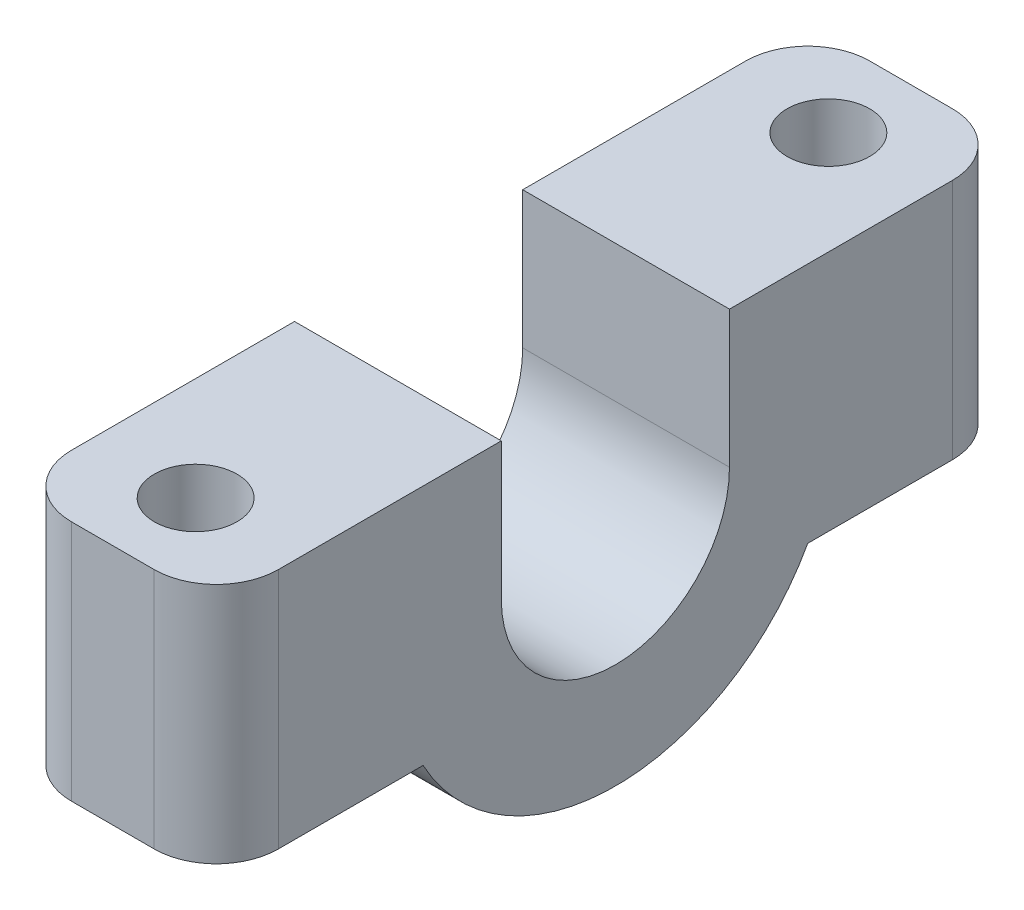
ISO-10303-21;
HEADER;
FILE_DESCRIPTION(('STEP AP214'),'2;1');
FILE_NAME('part.step','',(''),(''),'','','');
FILE_SCHEMA(('AUTOMOTIVE_DESIGN { 1 0 10303 214 1 1 1 1 }'));
ENDSEC;
DATA;
#1=APPLICATION_CONTEXT('core data for automotive mechanical design processes');
#2=APPLICATION_PROTOCOL_DEFINITION('international standard','automotive_design',2000,#1);
#3=PRODUCT_CONTEXT('',#1,'mechanical');
#4=PRODUCT('Part','Part','',(#3));
#5=PRODUCT_RELATED_PRODUCT_CATEGORY('part','',(#4));
#6=PRODUCT_DEFINITION_FORMATION('','',#4);
#7=PRODUCT_DEFINITION_CONTEXT('part definition',#1,'design');
#8=PRODUCT_DEFINITION('design','',#6,#7);
#9=PRODUCT_DEFINITION_SHAPE('','',#8);
#10=(LENGTH_UNIT() NAMED_UNIT(*) SI_UNIT(.MILLI.,.METRE.));
#11=(NAMED_UNIT(*) PLANE_ANGLE_UNIT() SI_UNIT($,.RADIAN.));
#12=(NAMED_UNIT(*) SI_UNIT($,.STERADIAN.) SOLID_ANGLE_UNIT());
#13=UNCERTAINTY_MEASURE_WITH_UNIT(LENGTH_MEASURE(1.E-05),#10,'distance_accuracy_value','');
#14=(GEOMETRIC_REPRESENTATION_CONTEXT(3) GLOBAL_UNCERTAINTY_ASSIGNED_CONTEXT((#13)) GLOBAL_UNIT_ASSIGNED_CONTEXT((#10,
#11,#12)) REPRESENTATION_CONTEXT('',''));
#15=CARTESIAN_POINT('',(0.,0.,0.));
#16=DIRECTION('',(0.,0.,1.));
#17=DIRECTION('',(1.,0.,0.));
#18=AXIS2_PLACEMENT_3D('',#15,#16,#17);
#19=CARTESIAN_POINT('',(20.,0.,0.));
#20=DIRECTION('',(-1.,0.,0.));
#21=DIRECTION('',(0.,0.,1.));
#22=AXIS2_PLACEMENT_3D('',#19,#20,#21);
#23=CYLINDRICAL_SURFACE('',#22,11.035);
#24=CARTESIAN_POINT('',(0.,0.,0.));
#25=DIRECTION('',(-1.,0.,0.));
#26=DIRECTION('',(0.,0.,-1.));
#27=AXIS2_PLACEMENT_3D('',#24,#25,#26);
#28=CIRCLE('',#27,11.035);
#29=CARTESIAN_POINT('',(0.,0.,-11.035));
#30=VERTEX_POINT('',#29);
#31=CARTESIAN_POINT('',(0.,0.,11.035));
#32=VERTEX_POINT('',#31);
#33=EDGE_CURVE('E181',#30,#32,#28,.T.);
#34=ORIENTED_EDGE('',*,*,#33,.T.);
#35=DIRECTION('',(-1.,0.,0.));
#36=VECTOR('',#35,1.);
#37=CARTESIAN_POINT('',(20.,0.,11.035));
#38=LINE('',#37,#36);
#39=CARTESIAN_POINT('',(20.,0.,11.035));
#40=VERTEX_POINT('',#39);
#41=EDGE_CURVE('E159',#40,#32,#38,.T.);
#42=ORIENTED_EDGE('',*,*,#41,.F.);
#43=CARTESIAN_POINT('',(20.,0.,0.));
#44=DIRECTION('',(-1.,0.,0.));
#45=DIRECTION('',(0.,0.,-1.));
#46=AXIS2_PLACEMENT_3D('',#43,#44,#45);
#47=CIRCLE('',#46,11.035);
#48=CARTESIAN_POINT('',(20.,0.,-11.035));
#49=VERTEX_POINT('',#48);
#50=EDGE_CURVE('E166',#49,#40,#47,.T.);
#51=ORIENTED_EDGE('',*,*,#50,.F.);
#52=DIRECTION('',(-1.,0.,0.));
#53=VECTOR('',#52,1.);
#54=CARTESIAN_POINT('',(20.,0.,-11.035));
#55=LINE('',#54,#53);
#56=EDGE_CURVE('E252',#49,#30,#55,.T.);
#57=ORIENTED_EDGE('',*,*,#56,.T.);
#58=EDGE_LOOP('',(#34,#42,#51,#57));
#59=FACE_BOUND('',#58,.T.);
#60=ADVANCED_FACE('F52',(#59),#23,.F.);
#61=CARTESIAN_POINT('',(20.,13.245,11.035));
#62=DIRECTION('',(0.,0.,1.));
#63=DIRECTION('',(1.,0.,0.));
#64=AXIS2_PLACEMENT_3D('',#61,#62,#63);
#65=PLANE('',#64);
#66=DIRECTION('',(0.,1.,0.));
#67=VECTOR('',#66,1.);
#68=CARTESIAN_POINT('',(0.,13.245,11.035));
#69=LINE('',#68,#67);
#70=CARTESIAN_POINT('',(0.,13.245,11.035));
#71=VERTEX_POINT('',#70);
#72=EDGE_CURVE('E289',#32,#71,#69,.T.);
#73=ORIENTED_EDGE('',*,*,#72,.T.);
#74=DIRECTION('',(-1.,0.,0.));
#75=VECTOR('',#74,1.);
#76=CARTESIAN_POINT('',(20.,13.245,11.035));
#77=LINE('',#76,#75);
#78=CARTESIAN_POINT('',(20.,13.245,11.035));
#79=VERTEX_POINT('',#78);
#80=EDGE_CURVE('E162',#79,#71,#77,.T.);
#81=ORIENTED_EDGE('',*,*,#80,.F.);
#82=DIRECTION('',(0.,1.,0.));
#83=VECTOR('',#82,1.);
#84=CARTESIAN_POINT('',(20.,13.245,11.035));
#85=LINE('',#84,#83);
#86=EDGE_CURVE('E152',#40,#79,#85,.T.);
#87=ORIENTED_EDGE('',*,*,#86,.F.);
#88=ORIENTED_EDGE('',*,*,#41,.T.);
#89=EDGE_LOOP('',(#73,#81,#87,#88));
#90=FACE_BOUND('',#89,.T.);
#91=ADVANCED_FACE('F160',(#90),#65,.F.);
#92=CARTESIAN_POINT('',(20.,13.245,38.6011404220279));
#93=DIRECTION('',(0.,-1.,0.));
#94=DIRECTION('',(0.,0.,-1.));
#95=AXIS2_PLACEMENT_3D('',#92,#93,#94);
#96=PLANE('',#95);
#97=CARTESIAN_POINT('',(10.,13.245,30.6));
#98=DIRECTION('',(0.,1.,0.));
#99=DIRECTION('',(0.,0.,1.));
#100=AXIS2_PLACEMENT_3D('',#97,#98,#99);
#101=CIRCLE('',#100,4.);
#102=CARTESIAN_POINT('',(10.,13.245,34.6));
#103=VERTEX_POINT('',#102);
#104=EDGE_CURVE('E313',#103,#103,#101,.T.);
#105=ORIENTED_EDGE('',*,*,#104,.F.);
#106=EDGE_LOOP('',(#105));
#107=FACE_BOUND('',#106,.T.);
#108=DIRECTION('',(0.,0.,1.));
#109=VECTOR('',#108,1.);
#110=CARTESIAN_POINT('',(0.,13.245,38.6011404220279));
#111=LINE('',#110,#109);
#112=CARTESIAN_POINT('',(0.,13.245,32.6011404220279));
#113=VERTEX_POINT('',#112);
#114=EDGE_CURVE('E282',#71,#113,#111,.T.);
#115=ORIENTED_EDGE('',*,*,#114,.T.);
#116=CARTESIAN_POINT('',(6.,13.245,32.6011404220279));
#117=DIRECTION('',(0.,-1.,0.));
#118=DIRECTION('',(0.,0.,-1.));
#119=AXIS2_PLACEMENT_3D('',#116,#117,#118);
#120=CIRCLE('',#119,6.);
#121=CARTESIAN_POINT('',(6.,13.245,38.6011404220279));
#122=VERTEX_POINT('',#121);
#123=EDGE_CURVE('E215',#113,#122,#120,.F.);
#124=ORIENTED_EDGE('',*,*,#123,.T.);
#125=DIRECTION('',(-1.,0.,0.));
#126=VECTOR('',#125,1.);
#127=CARTESIAN_POINT('',(20.,13.245,38.6011404220279));
#128=LINE('',#127,#126);
#129=CARTESIAN_POINT('',(14.,13.245,38.6011404220279));
#130=VERTEX_POINT('',#129);
#131=EDGE_CURVE('E188',#130,#122,#128,.T.);
#132=ORIENTED_EDGE('',*,*,#131,.F.);
#133=CARTESIAN_POINT('',(14.,13.245,32.6011404220279));
#134=DIRECTION('',(0.,-1.,0.));
#135=DIRECTION('',(0.,0.,-1.));
#136=AXIS2_PLACEMENT_3D('',#133,#134,#135);
#137=CIRCLE('',#136,6.);
#138=CARTESIAN_POINT('',(20.,13.245,32.6011404220279));
#139=VERTEX_POINT('',#138);
#140=EDGE_CURVE('E209',#130,#139,#137,.F.);
#141=ORIENTED_EDGE('',*,*,#140,.T.);
#142=DIRECTION('',(0.,0.,1.));
#143=VECTOR('',#142,1.);
#144=CARTESIAN_POINT('',(20.,13.245,38.6011404220279));
#145=LINE('',#144,#143);
#146=EDGE_CURVE('E170',#79,#139,#145,.T.);
#147=ORIENTED_EDGE('',*,*,#146,.F.);
#148=ORIENTED_EDGE('',*,*,#80,.T.);
#149=EDGE_LOOP('',(#115,#124,#132,#141,#147,#148));
#150=FACE_BOUND('',#149,.T.);
#151=ADVANCED_FACE('F328',(#107,#150),#96,.F.);
#152=CARTESIAN_POINT('',(20.,0.,38.6011404220279));
#153=DIRECTION('',(0.,0.,-1.));
#154=DIRECTION('',(-1.,0.,0.));
#155=AXIS2_PLACEMENT_3D('',#152,#153,#154);
#156=PLANE('',#155);
#157=ORIENTED_EDGE('',*,*,#131,.T.);
#158=DIRECTION('',(0.,-1.,0.));
#159=VECTOR('',#158,1.);
#160=CARTESIAN_POINT('',(6.,0.,38.6011404220279));
#161=LINE('',#160,#159);
#162=CARTESIAN_POINT('',(6.,-10.16,38.6011404220279));
#163=VERTEX_POINT('',#162);
#164=EDGE_CURVE('E190',#122,#163,#161,.T.);
#165=ORIENTED_EDGE('',*,*,#164,.T.);
#166=DIRECTION('',(-1.,0.,0.));
#167=VECTOR('',#166,1.);
#168=CARTESIAN_POINT('',(20.,-10.16,38.6011404220279));
#169=LINE('',#168,#167);
#170=CARTESIAN_POINT('',(14.,-10.16,38.6011404220279));
#171=VERTEX_POINT('',#170);
#172=EDGE_CURVE('E238',#171,#163,#169,.T.);
#173=ORIENTED_EDGE('',*,*,#172,.F.);
#174=DIRECTION('',(0.,-1.,0.));
#175=VECTOR('',#174,1.);
#176=CARTESIAN_POINT('',(14.,13.245,38.6011404220279));
#177=LINE('',#176,#175);
#178=EDGE_CURVE('E182',#171,#130,#177,.F.);
#179=ORIENTED_EDGE('',*,*,#178,.T.);
#180=EDGE_LOOP('',(#157,#165,#173,#179));
#181=FACE_BOUND('',#180,.T.);
#182=ADVANCED_FACE('F329',(#181),#156,.F.);
#183=CARTESIAN_POINT('',(20.,-10.16,18.6011404220279));
#184=DIRECTION('',(0.,1.,0.));
#185=DIRECTION('',(0.,0.,1.));
#186=AXIS2_PLACEMENT_3D('',#183,#184,#185);
#187=PLANE('',#186);
#188=CARTESIAN_POINT('',(10.,-10.16,30.6));
#189=DIRECTION('',(0.,1.,0.));
#190=DIRECTION('',(0.,0.,1.));
#191=AXIS2_PLACEMENT_3D('',#188,#189,#190);
#192=CIRCLE('',#191,4.);
#193=CARTESIAN_POINT('',(10.,-10.16,34.6));
#194=VERTEX_POINT('',#193);
#195=EDGE_CURVE('E295',#194,#194,#192,.F.);
#196=ORIENTED_EDGE('',*,*,#195,.F.);
#197=EDGE_LOOP('',(#196));
#198=FACE_BOUND('',#197,.T.);
#199=ORIENTED_EDGE('',*,*,#172,.T.);
#200=CARTESIAN_POINT('',(6.,-10.16,32.6011404220279));
#201=DIRECTION('',(0.,1.,0.));
#202=DIRECTION('',(0.,0.,1.));
#203=AXIS2_PLACEMENT_3D('',#200,#201,#202);
#204=CIRCLE('',#203,6.);
#205=CARTESIAN_POINT('',(0.,-10.16,32.6011404220279));
#206=VERTEX_POINT('',#205);
#207=EDGE_CURVE('E197',#163,#206,#204,.F.);
#208=ORIENTED_EDGE('',*,*,#207,.T.);
#209=DIRECTION('',(0.,0.,-1.));
#210=VECTOR('',#209,1.);
#211=CARTESIAN_POINT('',(0.,-10.16,18.6011404220279));
#212=LINE('',#211,#210);
#213=CARTESIAN_POINT('',(0.,-10.16,18.6011404220279));
#214=VERTEX_POINT('',#213);
#215=EDGE_CURVE('E285',#206,#214,#212,.T.);
#216=ORIENTED_EDGE('',*,*,#215,.T.);
#217=DIRECTION('',(-1.,0.,0.));
#218=VECTOR('',#217,1.);
#219=CARTESIAN_POINT('',(20.,-10.16,18.6011404220279));
#220=LINE('',#219,#218);
#221=CARTESIAN_POINT('',(20.,-10.16,18.6011404220279));
#222=VERTEX_POINT('',#221);
#223=EDGE_CURVE('E239',#222,#214,#220,.T.);
#224=ORIENTED_EDGE('',*,*,#223,.F.);
#225=DIRECTION('',(0.,0.,-1.));
#226=VECTOR('',#225,1.);
#227=CARTESIAN_POINT('',(20.,-10.16,18.6011404220279));
#228=LINE('',#227,#226);
#229=CARTESIAN_POINT('',(20.,-10.16,32.6011404220279));
#230=VERTEX_POINT('',#229);
#231=EDGE_CURVE('E310',#230,#222,#228,.T.);
#232=ORIENTED_EDGE('',*,*,#231,.F.);
#233=CARTESIAN_POINT('',(14.,-10.16,32.6011404220279));
#234=DIRECTION('',(0.,1.,0.));
#235=DIRECTION('',(0.,0.,1.));
#236=AXIS2_PLACEMENT_3D('',#233,#234,#235);
#237=CIRCLE('',#236,6.);
#238=EDGE_CURVE('E200',#230,#171,#237,.F.);
#239=ORIENTED_EDGE('',*,*,#238,.T.);
#240=EDGE_LOOP('',(#199,#208,#216,#224,#232,#239));
#241=FACE_BOUND('',#240,.T.);
#242=ADVANCED_FACE('F338',(#198,#241),#187,.F.);
#243=CARTESIAN_POINT('',(20.,0.,0.));
#244=DIRECTION('',(-1.,0.,0.));
#245=DIRECTION('',(0.,0.,1.));
#246=AXIS2_PLACEMENT_3D('',#243,#244,#245);
#247=CYLINDRICAL_SURFACE('',#246,21.195);
#248=CARTESIAN_POINT('',(0.,0.,0.));
#249=DIRECTION('',(1.,0.,0.));
#250=DIRECTION('',(0.,0.,-1.));
#251=AXIS2_PLACEMENT_3D('',#248,#249,#250);
#252=CIRCLE('',#251,21.195);
#253=CARTESIAN_POINT('',(0.,-10.16,-18.6011404220279));
#254=VERTEX_POINT('',#253);
#255=EDGE_CURVE('E276',#214,#254,#252,.T.);
#256=ORIENTED_EDGE('',*,*,#255,.T.);
#257=DIRECTION('',(-1.,0.,0.));
#258=VECTOR('',#257,1.);
#259=CARTESIAN_POINT('',(20.,-10.16,-18.6011404220279));
#260=LINE('',#259,#258);
#261=CARTESIAN_POINT('',(20.,-10.16,-18.6011404220279));
#262=VERTEX_POINT('',#261);
#263=EDGE_CURVE('E244',#262,#254,#260,.T.);
#264=ORIENTED_EDGE('',*,*,#263,.F.);
#265=CARTESIAN_POINT('',(20.,0.,0.));
#266=DIRECTION('',(1.,0.,0.));
#267=DIRECTION('',(0.,0.,-1.));
#268=AXIS2_PLACEMENT_3D('',#265,#266,#267);
#269=CIRCLE('',#268,21.195);
#270=EDGE_CURVE('E302',#222,#262,#269,.T.);
#271=ORIENTED_EDGE('',*,*,#270,.F.);
#272=ORIENTED_EDGE('',*,*,#223,.T.);
#273=EDGE_LOOP('',(#256,#264,#271,#272));
#274=FACE_BOUND('',#273,.T.);
#275=ADVANCED_FACE('F355',(#274),#247,.T.);
#276=CARTESIAN_POINT('',(20.,-10.16,-38.6011404220279));
#277=DIRECTION('',(0.,1.,0.));
#278=DIRECTION('',(0.,0.,1.));
#279=AXIS2_PLACEMENT_3D('',#276,#277,#278);
#280=PLANE('',#279);
#281=CARTESIAN_POINT('',(10.,-10.16,-30.6));
#282=DIRECTION('',(0.,1.,0.));
#283=DIRECTION('',(0.,0.,1.));
#284=AXIS2_PLACEMENT_3D('',#281,#282,#283);
#285=CIRCLE('',#284,4.);
#286=CARTESIAN_POINT('',(10.,-10.16,-26.6));
#287=VERTEX_POINT('',#286);
#288=EDGE_CURVE('E254',#287,#287,#285,.F.);
#289=ORIENTED_EDGE('',*,*,#288,.F.);
#290=EDGE_LOOP('',(#289));
#291=FACE_BOUND('',#290,.T.);
#292=DIRECTION('',(-1.,0.,0.));
#293=VECTOR('',#292,1.);
#294=CARTESIAN_POINT('',(20.,-10.16,-38.6011404220279));
#295=LINE('',#294,#293);
#296=CARTESIAN_POINT('',(14.,-10.16,-38.6011404220279));
#297=VERTEX_POINT('',#296);
#298=CARTESIAN_POINT('',(6.,-10.16,-38.6011404220279));
#299=VERTEX_POINT('',#298);
#300=EDGE_CURVE('E243',#297,#299,#295,.T.);
#301=ORIENTED_EDGE('',*,*,#300,.F.);
#302=CARTESIAN_POINT('',(14.,-10.16,-32.6011404220279));
#303=DIRECTION('',(0.,1.,0.));
#304=DIRECTION('',(0.,0.,1.));
#305=AXIS2_PLACEMENT_3D('',#302,#303,#304);
#306=CIRCLE('',#305,6.);
#307=CARTESIAN_POINT('',(20.,-10.16,-32.6011404220279));
#308=VERTEX_POINT('',#307);
#309=EDGE_CURVE('E11',#297,#308,#306,.F.);
#310=ORIENTED_EDGE('',*,*,#309,.T.);
#311=DIRECTION('',(0.,0.,-1.));
#312=VECTOR('',#311,1.);
#313=CARTESIAN_POINT('',(20.,-10.16,-38.6011404220279));
#314=LINE('',#313,#312);
#315=EDGE_CURVE('E297',#262,#308,#314,.T.);
#316=ORIENTED_EDGE('',*,*,#315,.F.);
#317=ORIENTED_EDGE('',*,*,#263,.T.);
#318=DIRECTION('',(0.,0.,-1.));
#319=VECTOR('',#318,1.);
#320=CARTESIAN_POINT('',(0.,-10.16,-38.6011404220279));
#321=LINE('',#320,#319);
#322=CARTESIAN_POINT('',(0.,-10.16,-32.6011404220279));
#323=VERTEX_POINT('',#322);
#324=EDGE_CURVE('E277',#254,#323,#321,.T.);
#325=ORIENTED_EDGE('',*,*,#324,.T.);
#326=CARTESIAN_POINT('',(6.,-10.16,-32.6011404220279));
#327=DIRECTION('',(0.,1.,0.));
#328=DIRECTION('',(0.,0.,1.));
#329=AXIS2_PLACEMENT_3D('',#326,#327,#328);
#330=CIRCLE('',#329,6.);
#331=EDGE_CURVE('E65',#323,#299,#330,.F.);
#332=ORIENTED_EDGE('',*,*,#331,.T.);
#333=EDGE_LOOP('',(#301,#310,#316,#317,#325,#332));
#334=FACE_BOUND('',#333,.T.);
#335=ADVANCED_FACE('F351',(#291,#334),#280,.F.);
#336=CARTESIAN_POINT('',(20.,13.245,-38.6011404220279));
#337=DIRECTION('',(0.,0.,1.));
#338=DIRECTION('',(1.,0.,0.));
#339=AXIS2_PLACEMENT_3D('',#336,#337,#338);
#340=PLANE('',#339);
#341=DIRECTION('',(-1.,0.,0.));
#342=VECTOR('',#341,1.);
#343=CARTESIAN_POINT('',(20.,13.245,-38.6011404220279));
#344=LINE('',#343,#342);
#345=CARTESIAN_POINT('',(14.,13.245,-38.6011404220279));
#346=VERTEX_POINT('',#345);
#347=CARTESIAN_POINT('',(6.,13.245,-38.6011404220279));
#348=VERTEX_POINT('',#347);
#349=EDGE_CURVE('E246',#346,#348,#344,.T.);
#350=ORIENTED_EDGE('',*,*,#349,.F.);
#351=DIRECTION('',(0.,1.,0.));
#352=VECTOR('',#351,1.);
#353=CARTESIAN_POINT('',(14.,-10.16,-38.6011404220279));
#354=LINE('',#353,#352);
#355=EDGE_CURVE('E71',#346,#297,#354,.F.);
#356=ORIENTED_EDGE('',*,*,#355,.T.);
#357=ORIENTED_EDGE('',*,*,#300,.T.);
#358=DIRECTION('',(0.,1.,0.));
#359=VECTOR('',#358,1.);
#360=CARTESIAN_POINT('',(6.,13.245,-38.6011404220279));
#361=LINE('',#360,#359);
#362=EDGE_CURVE('E230',#299,#348,#361,.T.);
#363=ORIENTED_EDGE('',*,*,#362,.T.);
#364=EDGE_LOOP('',(#350,#356,#357,#363));
#365=FACE_BOUND('',#364,.T.);
#366=ADVANCED_FACE('F364',(#365),#340,.F.);
#367=CARTESIAN_POINT('',(20.,13.245,-11.035));
#368=DIRECTION('',(0.,-1.,0.));
#369=DIRECTION('',(0.,0.,-1.));
#370=AXIS2_PLACEMENT_3D('',#367,#368,#369);
#371=PLANE('',#370);
#372=CARTESIAN_POINT('',(10.,13.245,-30.6));
#373=DIRECTION('',(0.,1.,0.));
#374=DIRECTION('',(0.,0.,1.));
#375=AXIS2_PLACEMENT_3D('',#372,#373,#374);
#376=CIRCLE('',#375,4.);
#377=CARTESIAN_POINT('',(10.,13.245,-26.6));
#378=VERTEX_POINT('',#377);
#379=EDGE_CURVE('E253',#378,#378,#376,.T.);
#380=ORIENTED_EDGE('',*,*,#379,.F.);
#381=EDGE_LOOP('',(#380));
#382=FACE_BOUND('',#381,.T.);
#383=DIRECTION('',(0.,0.,1.));
#384=VECTOR('',#383,1.);
#385=CARTESIAN_POINT('',(20.,13.245,-11.035));
#386=LINE('',#385,#384);
#387=CARTESIAN_POINT('',(20.,13.245,-32.6011404220279));
#388=VERTEX_POINT('',#387);
#389=CARTESIAN_POINT('',(20.,13.245,-11.035));
#390=VERTEX_POINT('',#389);
#391=EDGE_CURVE('E300',#388,#390,#386,.T.);
#392=ORIENTED_EDGE('',*,*,#391,.F.);
#393=CARTESIAN_POINT('',(14.,13.245,-32.6011404220279));
#394=DIRECTION('',(0.,-1.,0.));
#395=DIRECTION('',(0.,0.,-1.));
#396=AXIS2_PLACEMENT_3D('',#393,#394,#395);
#397=CIRCLE('',#396,6.);
#398=EDGE_CURVE('E228',#388,#346,#397,.F.);
#399=ORIENTED_EDGE('',*,*,#398,.T.);
#400=ORIENTED_EDGE('',*,*,#349,.T.);
#401=CARTESIAN_POINT('',(6.,13.245,-32.6011404220279));
#402=DIRECTION('',(0.,-1.,0.));
#403=DIRECTION('',(0.,0.,-1.));
#404=AXIS2_PLACEMENT_3D('',#401,#402,#403);
#405=CIRCLE('',#404,6.);
#406=CARTESIAN_POINT('',(0.,13.245,-32.6011404220279));
#407=VERTEX_POINT('',#406);
#408=EDGE_CURVE('E223',#348,#407,#405,.F.);
#409=ORIENTED_EDGE('',*,*,#408,.T.);
#410=DIRECTION('',(0.,0.,1.));
#411=VECTOR('',#410,1.);
#412=CARTESIAN_POINT('',(0.,13.245,-11.035));
#413=LINE('',#412,#411);
#414=CARTESIAN_POINT('',(0.,13.245,-11.035));
#415=VERTEX_POINT('',#414);
#416=EDGE_CURVE('E240',#407,#415,#413,.T.);
#417=ORIENTED_EDGE('',*,*,#416,.T.);
#418=DIRECTION('',(-1.,0.,0.));
#419=VECTOR('',#418,1.);
#420=CARTESIAN_POINT('',(20.,13.245,-11.035));
#421=LINE('',#420,#419);
#422=EDGE_CURVE('E247',#390,#415,#421,.T.);
#423=ORIENTED_EDGE('',*,*,#422,.F.);
#424=EDGE_LOOP('',(#392,#399,#400,#409,#417,#423));
#425=FACE_BOUND('',#424,.T.);
#426=ADVANCED_FACE('F365',(#382,#425),#371,.F.);
#427=CARTESIAN_POINT('',(20.,0.,-11.035));
#428=DIRECTION('',(0.,0.,-1.));
#429=DIRECTION('',(-1.,0.,0.));
#430=AXIS2_PLACEMENT_3D('',#427,#428,#429);
#431=PLANE('',#430);
#432=DIRECTION('',(0.,-1.,0.));
#433=VECTOR('',#432,1.);
#434=CARTESIAN_POINT('',(0.,0.,-11.035));
#435=LINE('',#434,#433);
#436=EDGE_CURVE('E178',#415,#30,#435,.T.);
#437=ORIENTED_EDGE('',*,*,#436,.T.);
#438=ORIENTED_EDGE('',*,*,#56,.F.);
#439=DIRECTION('',(0.,-1.,0.));
#440=VECTOR('',#439,1.);
#441=CARTESIAN_POINT('',(20.,0.,-11.035));
#442=LINE('',#441,#440);
#443=EDGE_CURVE('E173',#390,#49,#442,.T.);
#444=ORIENTED_EDGE('',*,*,#443,.F.);
#445=ORIENTED_EDGE('',*,*,#422,.T.);
#446=EDGE_LOOP('',(#437,#438,#444,#445));
#447=FACE_BOUND('',#446,.T.);
#448=ADVANCED_FACE('F375',(#447),#431,.F.);
#449=CARTESIAN_POINT('',(20.,0.,0.));
#450=DIRECTION('',(1.,0.,0.));
#451=DIRECTION('',(0.,0.,-1.));
#452=AXIS2_PLACEMENT_3D('',#449,#450,#451);
#453=PLANE('',#452);
#454=ORIENTED_EDGE('',*,*,#146,.T.);
#455=DIRECTION('',(0.,-1.,0.));
#456=VECTOR('',#455,1.);
#457=CARTESIAN_POINT('',(20.,-10.16,32.6011404220279));
#458=LINE('',#457,#456);
#459=EDGE_CURVE('E219',#139,#230,#458,.T.);
#460=ORIENTED_EDGE('',*,*,#459,.T.);
#461=ORIENTED_EDGE('',*,*,#231,.T.);
#462=ORIENTED_EDGE('',*,*,#270,.T.);
#463=ORIENTED_EDGE('',*,*,#315,.T.);
#464=DIRECTION('',(0.,1.,0.));
#465=VECTOR('',#464,1.);
#466=CARTESIAN_POINT('',(20.,13.245,-32.6011404220279));
#467=LINE('',#466,#465);
#468=EDGE_CURVE('E213',#308,#388,#467,.T.);
#469=ORIENTED_EDGE('',*,*,#468,.T.);
#470=ORIENTED_EDGE('',*,*,#391,.T.);
#471=ORIENTED_EDGE('',*,*,#443,.T.);
#472=ORIENTED_EDGE('',*,*,#50,.T.);
#473=ORIENTED_EDGE('',*,*,#86,.T.);
#474=EDGE_LOOP('',(#454,#460,#461,#462,#463,#469,#470,#471,#472,#473));
#475=FACE_BOUND('',#474,.T.);
#476=ADVANCED_FACE('F171',(#475),#453,.T.);
#477=CARTESIAN_POINT('',(0.,0.,0.));
#478=DIRECTION('',(1.,0.,0.));
#479=DIRECTION('',(0.,0.,-1.));
#480=AXIS2_PLACEMENT_3D('',#477,#478,#479);
#481=PLANE('',#480);
#482=ORIENTED_EDGE('',*,*,#215,.F.);
#483=DIRECTION('',(0.,-1.,0.));
#484=VECTOR('',#483,1.);
#485=CARTESIAN_POINT('',(0.,0.,32.6011404220279));
#486=LINE('',#485,#484);
#487=EDGE_CURVE('E207',#206,#113,#486,.F.);
#488=ORIENTED_EDGE('',*,*,#487,.T.);
#489=ORIENTED_EDGE('',*,*,#114,.F.);
#490=ORIENTED_EDGE('',*,*,#72,.F.);
#491=ORIENTED_EDGE('',*,*,#33,.F.);
#492=ORIENTED_EDGE('',*,*,#436,.F.);
#493=ORIENTED_EDGE('',*,*,#416,.F.);
#494=DIRECTION('',(0.,1.,0.));
#495=VECTOR('',#494,1.);
#496=CARTESIAN_POINT('',(0.,0.,-32.6011404220279));
#497=LINE('',#496,#495);
#498=EDGE_CURVE('E203',#407,#323,#497,.F.);
#499=ORIENTED_EDGE('',*,*,#498,.T.);
#500=ORIENTED_EDGE('',*,*,#324,.F.);
#501=ORIENTED_EDGE('',*,*,#255,.F.);
#502=EDGE_LOOP('',(#482,#488,#489,#490,#491,#492,#493,#499,#500,#501));
#503=FACE_BOUND('',#502,.T.);
#504=ADVANCED_FACE('F369',(#503),#481,.F.);
#505=CARTESIAN_POINT('',(10.,-21.196,-30.6));
#506=DIRECTION('',(0.,1.,0.));
#507=DIRECTION('',(0.,0.,1.));
#508=AXIS2_PLACEMENT_3D('',#505,#506,#507);
#509=CYLINDRICAL_SURFACE('',#508,4.);
#510=ORIENTED_EDGE('',*,*,#379,.T.);
#511=EDGE_LOOP('',(#510));
#512=FACE_BOUND('',#511,.T.);
#513=ORIENTED_EDGE('',*,*,#288,.T.);
#514=EDGE_LOOP('',(#513));
#515=FACE_BOUND('',#514,.T.);
#516=ADVANCED_FACE('F425',(#512,#515),#509,.F.);
#517=CARTESIAN_POINT('',(10.,-21.196,30.6));
#518=DIRECTION('',(0.,1.,0.));
#519=DIRECTION('',(0.,0.,1.));
#520=AXIS2_PLACEMENT_3D('',#517,#518,#519);
#521=CYLINDRICAL_SURFACE('',#520,4.);
#522=ORIENTED_EDGE('',*,*,#104,.T.);
#523=EDGE_LOOP('',(#522));
#524=FACE_BOUND('',#523,.T.);
#525=ORIENTED_EDGE('',*,*,#195,.T.);
#526=EDGE_LOOP('',(#525));
#527=FACE_BOUND('',#526,.T.);
#528=ADVANCED_FACE('F324',(#524,#527),#521,.F.);
#529=CARTESIAN_POINT('',(6.,0.,32.6011404220279));
#530=DIRECTION('',(0.,-1.,0.));
#531=DIRECTION('',(0.,0.,-1.));
#532=AXIS2_PLACEMENT_3D('',#529,#530,#531);
#533=CYLINDRICAL_SURFACE('',#532,6.);
#534=ORIENTED_EDGE('',*,*,#123,.F.);
#535=ORIENTED_EDGE('',*,*,#487,.F.);
#536=ORIENTED_EDGE('',*,*,#207,.F.);
#537=ORIENTED_EDGE('',*,*,#164,.F.);
#538=EDGE_LOOP('',(#534,#535,#536,#537));
#539=FACE_BOUND('',#538,.T.);
#540=ADVANCED_FACE('F337',(#539),#533,.T.);
#541=CARTESIAN_POINT('',(14.,0.,32.6011404220279));
#542=DIRECTION('',(0.,1.,0.));
#543=DIRECTION('',(0.,0.,1.));
#544=AXIS2_PLACEMENT_3D('',#541,#542,#543);
#545=CYLINDRICAL_SURFACE('',#544,6.);
#546=ORIENTED_EDGE('',*,*,#140,.F.);
#547=ORIENTED_EDGE('',*,*,#178,.F.);
#548=ORIENTED_EDGE('',*,*,#238,.F.);
#549=ORIENTED_EDGE('',*,*,#459,.F.);
#550=EDGE_LOOP('',(#546,#547,#548,#549));
#551=FACE_BOUND('',#550,.T.);
#552=ADVANCED_FACE('F350',(#551),#545,.T.);
#553=CARTESIAN_POINT('',(14.,0.,-32.6011404220279));
#554=DIRECTION('',(0.,-1.,0.));
#555=DIRECTION('',(0.,0.,-1.));
#556=AXIS2_PLACEMENT_3D('',#553,#554,#555);
#557=CYLINDRICAL_SURFACE('',#556,6.);
#558=ORIENTED_EDGE('',*,*,#309,.F.);
#559=ORIENTED_EDGE('',*,*,#355,.F.);
#560=ORIENTED_EDGE('',*,*,#398,.F.);
#561=ORIENTED_EDGE('',*,*,#468,.F.);
#562=EDGE_LOOP('',(#558,#559,#560,#561));
#563=FACE_BOUND('',#562,.T.);
#564=ADVANCED_FACE('F359',(#563),#557,.T.);
#565=CARTESIAN_POINT('',(6.,13.245,-32.6011404220279));
#566=DIRECTION('',(0.,1.,0.));
#567=DIRECTION('',(0.,0.,1.));
#568=AXIS2_PLACEMENT_3D('',#565,#566,#567);
#569=CYLINDRICAL_SURFACE('',#568,6.);
#570=ORIENTED_EDGE('',*,*,#331,.F.);
#571=ORIENTED_EDGE('',*,*,#498,.F.);
#572=ORIENTED_EDGE('',*,*,#408,.F.);
#573=ORIENTED_EDGE('',*,*,#362,.F.);
#574=EDGE_LOOP('',(#570,#571,#572,#573));
#575=FACE_BOUND('',#574,.T.);
#576=ADVANCED_FACE('F54',(#575),#569,.T.);
#577=CLOSED_SHELL('',(#60,#91,#151,#182,#242,#275,#335,#366,#426,#448,#476,#504,#516,#528,#540,
#552,#564,#576));
#578=MANIFOLD_SOLID_BREP('B2',#577);
#579=ADVANCED_BREP_SHAPE_REPRESENTATION('',(#18,#578),#14);
#580=SHAPE_DEFINITION_REPRESENTATION(#9,#579);
ENDSEC;
END-ISO-10303-21;
